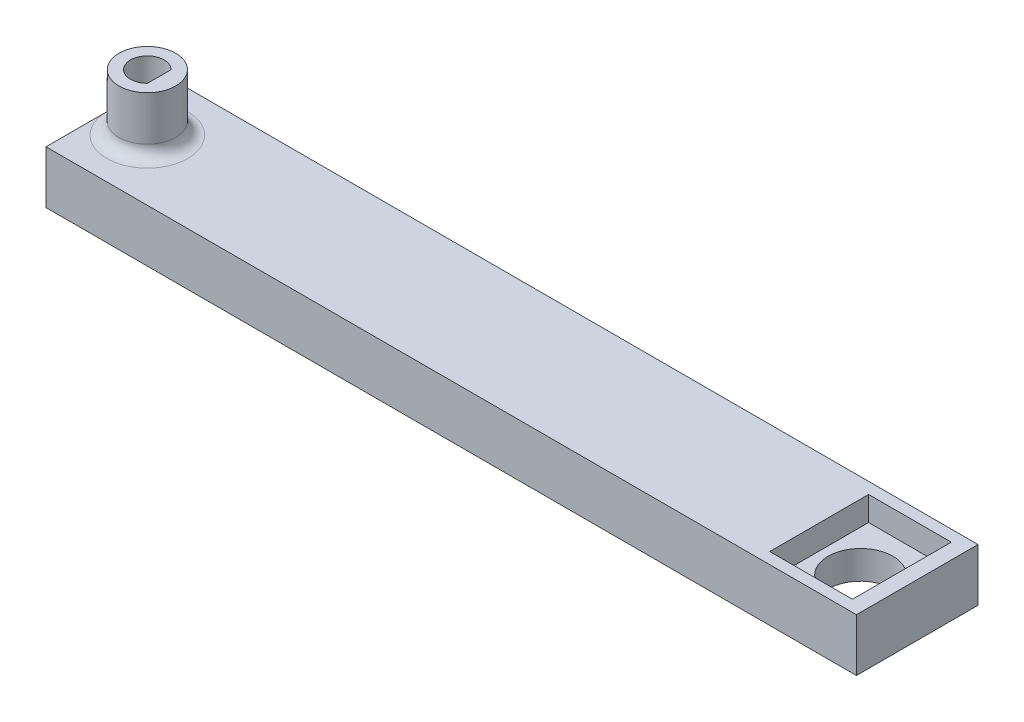
ISO-10303-21;
HEADER;
FILE_DESCRIPTION(('STEP AP214'),'2;1');
FILE_NAME('part.step','',(''),(''),'','','');
FILE_SCHEMA(('AUTOMOTIVE_DESIGN { 1 0 10303 214 1 1 1 1 }'));
ENDSEC;
DATA;
#1=APPLICATION_CONTEXT('core data for automotive mechanical design processes');
#2=APPLICATION_PROTOCOL_DEFINITION('international standard','automotive_design',2000,#1);
#3=PRODUCT_CONTEXT('',#1,'mechanical');
#4=PRODUCT('Part','Part','',(#3));
#5=PRODUCT_RELATED_PRODUCT_CATEGORY('part','',(#4));
#6=PRODUCT_DEFINITION_FORMATION('','',#4);
#7=PRODUCT_DEFINITION_CONTEXT('part definition',#1,'design');
#8=PRODUCT_DEFINITION('design','',#6,#7);
#9=PRODUCT_DEFINITION_SHAPE('','',#8);
#10=(LENGTH_UNIT() NAMED_UNIT(*) SI_UNIT(.MILLI.,.METRE.));
#11=(NAMED_UNIT(*) PLANE_ANGLE_UNIT() SI_UNIT($,.RADIAN.));
#12=(NAMED_UNIT(*) SI_UNIT($,.STERADIAN.) SOLID_ANGLE_UNIT());
#13=UNCERTAINTY_MEASURE_WITH_UNIT(LENGTH_MEASURE(1.E-05),#10,'distance_accuracy_value','');
#14=(GEOMETRIC_REPRESENTATION_CONTEXT(3) GLOBAL_UNCERTAINTY_ASSIGNED_CONTEXT((#13)) GLOBAL_UNIT_ASSIGNED_CONTEXT((#10,
#11,#12)) REPRESENTATION_CONTEXT('',''));
#15=CARTESIAN_POINT('',(0.,0.,0.));
#16=DIRECTION('',(0.,0.,1.));
#17=DIRECTION('',(1.,0.,0.));
#18=AXIS2_PLACEMENT_3D('',#15,#16,#17);
#19=CARTESIAN_POINT('',(-45.,10.25,0.));
#20=DIRECTION('',(0.,1.,0.));
#21=DIRECTION('',(0.,0.,1.));
#22=AXIS2_PLACEMENT_3D('',#19,#20,#21);
#23=PLANE('',#22);
#24=CARTESIAN_POINT('',(-45.,10.25,0.));
#25=DIRECTION('',(0.,1.,0.));
#26=DIRECTION('',(0.,0.,1.));
#27=AXIS2_PLACEMENT_3D('',#24,#25,#26);
#28=CIRCLE('',#27,3.5);
#29=CARTESIAN_POINT('',(-45.,10.25,3.5));
#30=VERTEX_POINT('',#29);
#31=EDGE_CURVE('E175',#30,#30,#28,.T.);
#32=ORIENTED_EDGE('',*,*,#31,.T.);
#33=EDGE_LOOP('',(#32));
#34=FACE_BOUND('',#33,.T.);
#35=CARTESIAN_POINT('',(-45.,10.25,0.));
#36=DIRECTION('',(0.,1.,0.));
#37=DIRECTION('',(0.,0.,1.));
#38=AXIS2_PLACEMENT_3D('',#35,#36,#37);
#39=CIRCLE('',#38,2.075);
#40=CARTESIAN_POINT('',(-43.525,10.25,-1.45945195193264));
#41=VERTEX_POINT('',#40);
#42=CARTESIAN_POINT('',(-43.525,10.25,1.45945195193264));
#43=VERTEX_POINT('',#42);
#44=EDGE_CURVE('E168',#41,#43,#39,.T.);
#45=ORIENTED_EDGE('',*,*,#44,.F.);
#46=DIRECTION('',(0.,0.,1.));
#47=VECTOR('',#46,1.);
#48=CARTESIAN_POINT('',(-43.525,10.25,0.));
#49=LINE('',#48,#47);
#50=EDGE_CURVE('E61',#41,#43,#49,.T.);
#51=ORIENTED_EDGE('',*,*,#50,.T.);
#52=EDGE_LOOP('',(#45,#51));
#53=FACE_BOUND('',#52,.T.);
#54=ADVANCED_FACE('F43',(#34,#53),#23,.T.);
#55=CARTESIAN_POINT('',(0.,-3.25,0.));
#56=DIRECTION('',(0.,-1.,0.));
#57=DIRECTION('',(0.,0.,-1.));
#58=AXIS2_PLACEMENT_3D('',#55,#56,#57);
#59=PLANE('',#58);
#60=CARTESIAN_POINT('',(43.,-3.25,0.));
#61=DIRECTION('',(0.,-1.,0.));
#62=DIRECTION('',(0.,0.,-1.));
#63=AXIS2_PLACEMENT_3D('',#60,#61,#62);
#64=CIRCLE('',#63,4.00000000000001);
#65=CARTESIAN_POINT('',(43.,-3.25,-4.00000000000001));
#66=VERTEX_POINT('',#65);
#67=EDGE_CURVE('E180',#66,#66,#64,.T.);
#68=ORIENTED_EDGE('',*,*,#67,.F.);
#69=EDGE_LOOP('',(#68));
#70=FACE_BOUND('',#69,.T.);
#71=DIRECTION('',(0.,0.,-1.));
#72=VECTOR('',#71,1.);
#73=CARTESIAN_POINT('',(50.,-3.25,7.5));
#74=LINE('',#73,#72);
#75=CARTESIAN_POINT('',(50.,-3.25,7.5));
#76=VERTEX_POINT('',#75);
#77=CARTESIAN_POINT('',(50.,-3.25,-7.5));
#78=VERTEX_POINT('',#77);
#79=EDGE_CURVE('E253',#76,#78,#74,.T.);
#80=ORIENTED_EDGE('',*,*,#79,.F.);
#81=DIRECTION('',(1.,0.,0.));
#82=VECTOR('',#81,1.);
#83=CARTESIAN_POINT('',(-50.,-3.25,7.5));
#84=LINE('',#83,#82);
#85=CARTESIAN_POINT('',(-50.,-3.25,7.5));
#86=VERTEX_POINT('',#85);
#87=EDGE_CURVE('E269',#86,#76,#84,.T.);
#88=ORIENTED_EDGE('',*,*,#87,.F.);
#89=DIRECTION('',(0.,0.,1.));
#90=VECTOR('',#89,1.);
#91=CARTESIAN_POINT('',(-50.,-3.25,7.5));
#92=LINE('',#91,#90);
#93=CARTESIAN_POINT('',(-50.,-3.25,-7.5));
#94=VERTEX_POINT('',#93);
#95=EDGE_CURVE('E282',#94,#86,#92,.T.);
#96=ORIENTED_EDGE('',*,*,#95,.F.);
#97=DIRECTION('',(-1.,0.,0.));
#98=VECTOR('',#97,1.);
#99=CARTESIAN_POINT('',(-50.,-3.25,-7.5));
#100=LINE('',#99,#98);
#101=EDGE_CURVE('E280',#78,#94,#100,.T.);
#102=ORIENTED_EDGE('',*,*,#101,.F.);
#103=EDGE_LOOP('',(#80,#88,#96,#102));
#104=FACE_BOUND('',#103,.T.);
#105=DIRECTION('',(0.,0.,1.));
#106=VECTOR('',#105,1.);
#107=CARTESIAN_POINT('',(23.5,-3.25,-1.125));
#108=LINE('',#107,#106);
#109=CARTESIAN_POINT('',(23.5,-3.25,-1.125));
#110=VERTEX_POINT('',#109);
#111=CARTESIAN_POINT('',(23.5,-3.25,1.125));
#112=VERTEX_POINT('',#111);
#113=EDGE_CURVE('E260',#110,#112,#108,.T.);
#114=ORIENTED_EDGE('',*,*,#113,.F.);
#115=DIRECTION('',(-1.,0.,0.));
#116=VECTOR('',#115,1.);
#117=CARTESIAN_POINT('',(0.,-3.25,-1.125));
#118=LINE('',#117,#116);
#119=CARTESIAN_POINT('',(15.,-3.25,-1.125));
#120=VERTEX_POINT('',#119);
#121=EDGE_CURVE('E219',#110,#120,#118,.T.);
#122=ORIENTED_EDGE('',*,*,#121,.T.);
#123=DIRECTION('',(0.,0.,1.));
#124=VECTOR('',#123,1.);
#125=CARTESIAN_POINT('',(15.,-3.25,-1.125));
#126=LINE('',#125,#124);
#127=CARTESIAN_POINT('',(15.,-3.25,1.125));
#128=VERTEX_POINT('',#127);
#129=EDGE_CURVE('E234',#120,#128,#126,.T.);
#130=ORIENTED_EDGE('',*,*,#129,.T.);
#131=DIRECTION('',(-1.,0.,0.));
#132=VECTOR('',#131,1.);
#133=CARTESIAN_POINT('',(0.,-3.25,1.125));
#134=LINE('',#133,#132);
#135=EDGE_CURVE('E237',#112,#128,#134,.T.);
#136=ORIENTED_EDGE('',*,*,#135,.F.);
#137=EDGE_LOOP('',(#114,#122,#130,#136));
#138=FACE_BOUND('',#137,.T.);
#139=ADVANCED_FACE('F309',(#70,#104,#138),#59,.T.);
#140=CARTESIAN_POINT('',(50.,3.25,7.5));
#141=DIRECTION('',(-1.,0.,0.));
#142=DIRECTION('',(0.,0.,1.));
#143=AXIS2_PLACEMENT_3D('',#140,#141,#142);
#144=PLANE('',#143);
#145=ORIENTED_EDGE('',*,*,#79,.T.);
#146=DIRECTION('',(0.,-1.,0.));
#147=VECTOR('',#146,1.);
#148=CARTESIAN_POINT('',(50.,3.25,-7.5));
#149=LINE('',#148,#147);
#150=CARTESIAN_POINT('',(50.,3.25,-7.5));
#151=VERTEX_POINT('',#150);
#152=EDGE_CURVE('E293',#151,#78,#149,.T.);
#153=ORIENTED_EDGE('',*,*,#152,.F.);
#154=DIRECTION('',(0.,0.,-1.));
#155=VECTOR('',#154,1.);
#156=CARTESIAN_POINT('',(50.,3.25,7.5));
#157=LINE('',#156,#155);
#158=CARTESIAN_POINT('',(50.,3.25,7.5));
#159=VERTEX_POINT('',#158);
#160=EDGE_CURVE('E265',#159,#151,#157,.T.);
#161=ORIENTED_EDGE('',*,*,#160,.F.);
#162=DIRECTION('',(0.,-1.,0.));
#163=VECTOR('',#162,1.);
#164=CARTESIAN_POINT('',(50.,3.25,7.5));
#165=LINE('',#164,#163);
#166=EDGE_CURVE('E277',#159,#76,#165,.T.);
#167=ORIENTED_EDGE('',*,*,#166,.T.);
#168=EDGE_LOOP('',(#145,#153,#161,#167));
#169=FACE_BOUND('',#168,.T.);
#170=ADVANCED_FACE('F315',(#169),#144,.F.);
#171=CARTESIAN_POINT('',(-50.,3.25,-7.5));
#172=DIRECTION('',(0.,0.,1.));
#173=DIRECTION('',(1.,0.,0.));
#174=AXIS2_PLACEMENT_3D('',#171,#172,#173);
#175=PLANE('',#174);
#176=ORIENTED_EDGE('',*,*,#101,.T.);
#177=DIRECTION('',(0.,-1.,0.));
#178=VECTOR('',#177,1.);
#179=CARTESIAN_POINT('',(-50.,3.25,-7.5));
#180=LINE('',#179,#178);
#181=CARTESIAN_POINT('',(-50.,3.25,-7.5));
#182=VERTEX_POINT('',#181);
#183=EDGE_CURVE('E290',#182,#94,#180,.T.);
#184=ORIENTED_EDGE('',*,*,#183,.F.);
#185=DIRECTION('',(-1.,0.,0.));
#186=VECTOR('',#185,1.);
#187=CARTESIAN_POINT('',(-50.,3.25,-7.5));
#188=LINE('',#187,#186);
#189=EDGE_CURVE('E268',#151,#182,#188,.T.);
#190=ORIENTED_EDGE('',*,*,#189,.F.);
#191=ORIENTED_EDGE('',*,*,#152,.T.);
#192=EDGE_LOOP('',(#176,#184,#190,#191));
#193=FACE_BOUND('',#192,.T.);
#194=ADVANCED_FACE('F387',(#193),#175,.F.);
#195=CARTESIAN_POINT('',(-50.,3.25,7.5));
#196=DIRECTION('',(1.,0.,0.));
#197=DIRECTION('',(0.,0.,-1.));
#198=AXIS2_PLACEMENT_3D('',#195,#196,#197);
#199=PLANE('',#198);
#200=ORIENTED_EDGE('',*,*,#95,.T.);
#201=DIRECTION('',(0.,-1.,0.));
#202=VECTOR('',#201,1.);
#203=CARTESIAN_POINT('',(-50.,3.25,7.5));
#204=LINE('',#203,#202);
#205=CARTESIAN_POINT('',(-50.,3.25,7.5));
#206=VERTEX_POINT('',#205);
#207=EDGE_CURVE('E287',#206,#86,#204,.T.);
#208=ORIENTED_EDGE('',*,*,#207,.F.);
#209=DIRECTION('',(0.,0.,1.));
#210=VECTOR('',#209,1.);
#211=CARTESIAN_POINT('',(-50.,3.25,7.5));
#212=LINE('',#211,#210);
#213=CARTESIAN_POINT('',(-50.,3.25,0.));
#214=VERTEX_POINT('',#213);
#215=EDGE_CURVE('E271',#214,#206,#212,.T.);
#216=ORIENTED_EDGE('',*,*,#215,.F.);
#217=EDGE_CURVE('E272',#182,#214,#212,.T.);
#218=ORIENTED_EDGE('',*,*,#217,.F.);
#219=ORIENTED_EDGE('',*,*,#183,.T.);
#220=EDGE_LOOP('',(#200,#208,#216,#218,#219));
#221=FACE_BOUND('',#220,.T.);
#222=ADVANCED_FACE('F383',(#221),#199,.F.);
#223=CARTESIAN_POINT('',(-50.,3.25,7.5));
#224=DIRECTION('',(0.,0.,-1.));
#225=DIRECTION('',(-1.,0.,0.));
#226=AXIS2_PLACEMENT_3D('',#223,#224,#225);
#227=PLANE('',#226);
#228=ORIENTED_EDGE('',*,*,#87,.T.);
#229=ORIENTED_EDGE('',*,*,#166,.F.);
#230=DIRECTION('',(1.,0.,0.));
#231=VECTOR('',#230,1.);
#232=CARTESIAN_POINT('',(-50.,3.25,7.5));
#233=LINE('',#232,#231);
#234=EDGE_CURVE('E275',#206,#159,#233,.T.);
#235=ORIENTED_EDGE('',*,*,#234,.F.);
#236=ORIENTED_EDGE('',*,*,#207,.T.);
#237=EDGE_LOOP('',(#228,#229,#235,#236));
#238=FACE_BOUND('',#237,.T.);
#239=ADVANCED_FACE('F378',(#238),#227,.F.);
#240=CARTESIAN_POINT('',(0.,3.25,0.));
#241=DIRECTION('',(0.,-1.,0.));
#242=DIRECTION('',(0.,0.,-1.));
#243=AXIS2_PLACEMENT_3D('',#240,#241,#242);
#244=PLANE('',#243);
#245=DIRECTION('',(-1.,0.,0.));
#246=VECTOR('',#245,1.);
#247=CARTESIAN_POINT('',(37.9,3.25,-6.1));
#248=LINE('',#247,#246);
#249=CARTESIAN_POINT('',(48.1,3.25,-6.1));
#250=VERTEX_POINT('',#249);
#251=CARTESIAN_POINT('',(37.9,3.25,-6.1));
#252=VERTEX_POINT('',#251);
#253=EDGE_CURVE('E199',#250,#252,#248,.T.);
#254=ORIENTED_EDGE('',*,*,#253,.F.);
#255=DIRECTION('',(0.,0.,-1.));
#256=VECTOR('',#255,1.);
#257=CARTESIAN_POINT('',(48.1,3.25,6.1));
#258=LINE('',#257,#256);
#259=CARTESIAN_POINT('',(48.1,3.25,6.1));
#260=VERTEX_POINT('',#259);
#261=EDGE_CURVE('E183',#260,#250,#258,.T.);
#262=ORIENTED_EDGE('',*,*,#261,.F.);
#263=DIRECTION('',(1.,0.,0.));
#264=VECTOR('',#263,1.);
#265=CARTESIAN_POINT('',(37.9,3.25,6.1));
#266=LINE('',#265,#264);
#267=CARTESIAN_POINT('',(37.9,3.25,6.1));
#268=VERTEX_POINT('',#267);
#269=EDGE_CURVE('E188',#268,#260,#266,.T.);
#270=ORIENTED_EDGE('',*,*,#269,.F.);
#271=DIRECTION('',(0.,0.,1.));
#272=VECTOR('',#271,1.);
#273=CARTESIAN_POINT('',(37.9,3.25,6.1));
#274=LINE('',#273,#272);
#275=EDGE_CURVE('E202',#252,#268,#274,.T.);
#276=ORIENTED_EDGE('',*,*,#275,.F.);
#277=EDGE_LOOP('',(#254,#262,#270,#276));
#278=FACE_BOUND('',#277,.T.);
#279=ORIENTED_EDGE('',*,*,#217,.T.);
#280=CARTESIAN_POINT('',(-45.,3.25,0.));
#281=DIRECTION('',(0.,-1.,0.));
#282=DIRECTION('',(0.,0.,-1.));
#283=AXIS2_PLACEMENT_3D('',#280,#281,#282);
#284=CIRCLE('',#283,5.);
#285=EDGE_CURVE('E11',#214,#214,#284,.T.);
#286=ORIENTED_EDGE('',*,*,#285,.T.);
#287=ORIENTED_EDGE('',*,*,#215,.T.);
#288=ORIENTED_EDGE('',*,*,#234,.T.);
#289=ORIENTED_EDGE('',*,*,#160,.T.);
#290=ORIENTED_EDGE('',*,*,#189,.T.);
#291=EDGE_LOOP('',(#279,#286,#287,#288,#289,#290));
#292=FACE_BOUND('',#291,.T.);
#293=ADVANCED_FACE('F375',(#278,#292),#244,.F.);
#294=CARTESIAN_POINT('',(15.,0.,-1.125));
#295=DIRECTION('',(1.,0.,0.));
#296=DIRECTION('',(0.,0.,-1.));
#297=AXIS2_PLACEMENT_3D('',#294,#295,#296);
#298=PLANE('',#297);
#299=DIRECTION('',(0.,1.,0.));
#300=VECTOR('',#299,1.);
#301=CARTESIAN_POINT('',(15.,0.,1.125));
#302=LINE('',#301,#300);
#303=CARTESIAN_POINT('',(15.,-2.25,1.125));
#304=VERTEX_POINT('',#303);
#305=EDGE_CURVE('E209',#128,#304,#302,.T.);
#306=ORIENTED_EDGE('',*,*,#305,.F.);
#307=ORIENTED_EDGE('',*,*,#129,.F.);
#308=DIRECTION('',(0.,1.,0.));
#309=VECTOR('',#308,1.);
#310=CARTESIAN_POINT('',(15.,0.,-1.125));
#311=LINE('',#310,#309);
#312=CARTESIAN_POINT('',(15.,-2.25,-1.125));
#313=VERTEX_POINT('',#312);
#314=EDGE_CURVE('E216',#120,#313,#311,.T.);
#315=ORIENTED_EDGE('',*,*,#314,.T.);
#316=DIRECTION('',(0.,0.,1.));
#317=VECTOR('',#316,1.);
#318=CARTESIAN_POINT('',(15.,-2.25,-1.125));
#319=LINE('',#318,#317);
#320=EDGE_CURVE('E250',#313,#304,#319,.T.);
#321=ORIENTED_EDGE('',*,*,#320,.T.);
#322=EDGE_LOOP('',(#306,#307,#315,#321));
#323=FACE_BOUND('',#322,.T.);
#324=ADVANCED_FACE('F361',(#323),#298,.T.);
#325=CARTESIAN_POINT('',(0.,-2.25,-1.125));
#326=DIRECTION('',(0.,1.,0.));
#327=DIRECTION('',(-1.,0.,0.));
#328=AXIS2_PLACEMENT_3D('',#325,#326,#327);
#329=PLANE('',#328);
#330=DIRECTION('',(-1.,0.,0.));
#331=VECTOR('',#330,1.);
#332=CARTESIAN_POINT('',(0.,-2.25,1.125));
#333=LINE('',#332,#331);
#334=CARTESIAN_POINT('',(9.99999999999999,-2.25,1.125));
#335=VERTEX_POINT('',#334);
#336=EDGE_CURVE('E220',#304,#335,#333,.T.);
#337=ORIENTED_EDGE('',*,*,#336,.F.);
#338=ORIENTED_EDGE('',*,*,#320,.F.);
#339=DIRECTION('',(-1.,0.,0.));
#340=VECTOR('',#339,1.);
#341=CARTESIAN_POINT('',(0.,-2.25,-1.125));
#342=LINE('',#341,#340);
#343=CARTESIAN_POINT('',(9.99999999999999,-2.25,-1.125));
#344=VERTEX_POINT('',#343);
#345=EDGE_CURVE('E232',#313,#344,#342,.T.);
#346=ORIENTED_EDGE('',*,*,#345,.T.);
#347=DIRECTION('',(0.,0.,1.));
#348=VECTOR('',#347,1.);
#349=CARTESIAN_POINT('',(9.99999999999999,-2.25,-1.125));
#350=LINE('',#349,#348);
#351=EDGE_CURVE('E254',#344,#335,#350,.T.);
#352=ORIENTED_EDGE('',*,*,#351,.T.);
#353=EDGE_LOOP('',(#337,#338,#346,#352));
#354=FACE_BOUND('',#353,.T.);
#355=ADVANCED_FACE('F357',(#354),#329,.T.);
#356=CARTESIAN_POINT('',(9.99999999999999,0.,-1.125));
#357=DIRECTION('',(-1.,0.,0.));
#358=DIRECTION('',(0.,0.,1.));
#359=AXIS2_PLACEMENT_3D('',#356,#357,#358);
#360=PLANE('',#359);
#361=DIRECTION('',(0.,-1.,0.));
#362=VECTOR('',#361,1.);
#363=CARTESIAN_POINT('',(9.99999999999999,0.,1.125));
#364=LINE('',#363,#362);
#365=CARTESIAN_POINT('',(9.99999999999999,1.,1.125));
#366=VERTEX_POINT('',#365);
#367=EDGE_CURVE('E245',#366,#335,#364,.T.);
#368=ORIENTED_EDGE('',*,*,#367,.T.);
#369=ORIENTED_EDGE('',*,*,#351,.F.);
#370=DIRECTION('',(0.,-1.,0.));
#371=VECTOR('',#370,1.);
#372=CARTESIAN_POINT('',(9.99999999999999,0.,-1.125));
#373=LINE('',#372,#371);
#374=CARTESIAN_POINT('',(9.99999999999999,1.,-1.125));
#375=VERTEX_POINT('',#374);
#376=EDGE_CURVE('E229',#375,#344,#373,.T.);
#377=ORIENTED_EDGE('',*,*,#376,.F.);
#378=DIRECTION('',(0.,0.,1.));
#379=VECTOR('',#378,1.);
#380=CARTESIAN_POINT('',(9.99999999999999,1.,-1.125));
#381=LINE('',#380,#379);
#382=EDGE_CURVE('E256',#375,#366,#381,.T.);
#383=ORIENTED_EDGE('',*,*,#382,.T.);
#384=EDGE_LOOP('',(#368,#369,#377,#383));
#385=FACE_BOUND('',#384,.T.);
#386=ADVANCED_FACE('F360',(#385),#360,.F.);
#387=CARTESIAN_POINT('',(0.,0.999999999999999,-1.125));
#388=DIRECTION('',(0.,1.,0.));
#389=DIRECTION('',(-1.,0.,0.));
#390=AXIS2_PLACEMENT_3D('',#387,#388,#389);
#391=PLANE('',#390);
#392=DIRECTION('',(-1.,0.,0.));
#393=VECTOR('',#392,1.);
#394=CARTESIAN_POINT('',(0.,0.999999999999999,1.125));
#395=LINE('',#394,#393);
#396=CARTESIAN_POINT('',(23.5,1.,1.125));
#397=VERTEX_POINT('',#396);
#398=EDGE_CURVE('E242',#397,#366,#395,.T.);
#399=ORIENTED_EDGE('',*,*,#398,.T.);
#400=ORIENTED_EDGE('',*,*,#382,.F.);
#401=DIRECTION('',(-1.,0.,0.));
#402=VECTOR('',#401,1.);
#403=CARTESIAN_POINT('',(0.,0.999999999999999,-1.125));
#404=LINE('',#403,#402);
#405=CARTESIAN_POINT('',(23.5,1.,-1.125));
#406=VERTEX_POINT('',#405);
#407=EDGE_CURVE('E226',#406,#375,#404,.T.);
#408=ORIENTED_EDGE('',*,*,#407,.F.);
#409=DIRECTION('',(0.,0.,1.));
#410=VECTOR('',#409,1.);
#411=CARTESIAN_POINT('',(23.5,1.,-1.125));
#412=LINE('',#411,#410);
#413=EDGE_CURVE('E258',#406,#397,#412,.T.);
#414=ORIENTED_EDGE('',*,*,#413,.T.);
#415=EDGE_LOOP('',(#399,#400,#408,#414));
#416=FACE_BOUND('',#415,.T.);
#417=ADVANCED_FACE('F365',(#416),#391,.F.);
#418=CARTESIAN_POINT('',(23.5,0.,-1.125));
#419=DIRECTION('',(1.,0.,0.));
#420=DIRECTION('',(0.,0.,-1.));
#421=AXIS2_PLACEMENT_3D('',#418,#419,#420);
#422=PLANE('',#421);
#423=DIRECTION('',(0.,1.,0.));
#424=VECTOR('',#423,1.);
#425=CARTESIAN_POINT('',(23.5,0.,1.125));
#426=LINE('',#425,#424);
#427=EDGE_CURVE('E239',#112,#397,#426,.T.);
#428=ORIENTED_EDGE('',*,*,#427,.T.);
#429=ORIENTED_EDGE('',*,*,#413,.F.);
#430=DIRECTION('',(0.,1.,0.));
#431=VECTOR('',#430,1.);
#432=CARTESIAN_POINT('',(23.5,0.,-1.125));
#433=LINE('',#432,#431);
#434=EDGE_CURVE('E223',#110,#406,#433,.T.);
#435=ORIENTED_EDGE('',*,*,#434,.F.);
#436=ORIENTED_EDGE('',*,*,#113,.T.);
#437=EDGE_LOOP('',(#428,#429,#435,#436));
#438=FACE_BOUND('',#437,.T.);
#439=ADVANCED_FACE('F352',(#438),#422,.F.);
#440=CARTESIAN_POINT('',(0.,0.,-1.125));
#441=DIRECTION('',(0.,0.,1.));
#442=DIRECTION('',(1.,0.,0.));
#443=AXIS2_PLACEMENT_3D('',#440,#441,#442);
#444=PLANE('',#443);
#445=ORIENTED_EDGE('',*,*,#314,.F.);
#446=ORIENTED_EDGE('',*,*,#121,.F.);
#447=ORIENTED_EDGE('',*,*,#434,.T.);
#448=ORIENTED_EDGE('',*,*,#407,.T.);
#449=ORIENTED_EDGE('',*,*,#376,.T.);
#450=ORIENTED_EDGE('',*,*,#345,.F.);
#451=EDGE_LOOP('',(#445,#446,#447,#448,#449,#450));
#452=FACE_BOUND('',#451,.T.);
#453=ADVANCED_FACE('F349',(#452),#444,.T.);
#454=CARTESIAN_POINT('',(0.,0.,1.125));
#455=DIRECTION('',(0.,0.,1.));
#456=DIRECTION('',(1.,0.,0.));
#457=AXIS2_PLACEMENT_3D('',#454,#455,#456);
#458=PLANE('',#457);
#459=ORIENTED_EDGE('',*,*,#305,.T.);
#460=ORIENTED_EDGE('',*,*,#336,.T.);
#461=ORIENTED_EDGE('',*,*,#367,.F.);
#462=ORIENTED_EDGE('',*,*,#398,.F.);
#463=ORIENTED_EDGE('',*,*,#427,.F.);
#464=ORIENTED_EDGE('',*,*,#135,.T.);
#465=EDGE_LOOP('',(#459,#460,#461,#462,#463,#464));
#466=FACE_BOUND('',#465,.T.);
#467=ADVANCED_FACE('F347',(#466),#458,.F.);
#468=CARTESIAN_POINT('',(48.1,0.25,6.1));
#469=DIRECTION('',(1.,0.,0.));
#470=DIRECTION('',(0.,0.,-1.));
#471=AXIS2_PLACEMENT_3D('',#468,#469,#470);
#472=PLANE('',#471);
#473=ORIENTED_EDGE('',*,*,#261,.T.);
#474=DIRECTION('',(0.,1.,0.));
#475=VECTOR('',#474,1.);
#476=CARTESIAN_POINT('',(48.1,0.25,-6.1));
#477=LINE('',#476,#475);
#478=CARTESIAN_POINT('',(48.1,0.25,-6.1));
#479=VERTEX_POINT('',#478);
#480=EDGE_CURVE('E197',#479,#250,#477,.T.);
#481=ORIENTED_EDGE('',*,*,#480,.F.);
#482=DIRECTION('',(0.,0.,-1.));
#483=VECTOR('',#482,1.);
#484=CARTESIAN_POINT('',(48.1,0.25,6.1));
#485=LINE('',#484,#483);
#486=CARTESIAN_POINT('',(48.1,0.25,6.1));
#487=VERTEX_POINT('',#486);
#488=EDGE_CURVE('E184',#487,#479,#485,.T.);
#489=ORIENTED_EDGE('',*,*,#488,.F.);
#490=DIRECTION('',(0.,1.,0.));
#491=VECTOR('',#490,1.);
#492=CARTESIAN_POINT('',(48.1,0.25,6.1));
#493=LINE('',#492,#491);
#494=EDGE_CURVE('E207',#487,#260,#493,.T.);
#495=ORIENTED_EDGE('',*,*,#494,.T.);
#496=EDGE_LOOP('',(#473,#481,#489,#495));
#497=FACE_BOUND('',#496,.T.);
#498=ADVANCED_FACE('F337',(#497),#472,.F.);
#499=CARTESIAN_POINT('',(37.9,0.25,6.1));
#500=DIRECTION('',(0.,0.,1.));
#501=DIRECTION('',(1.,0.,0.));
#502=AXIS2_PLACEMENT_3D('',#499,#500,#501);
#503=PLANE('',#502);
#504=ORIENTED_EDGE('',*,*,#269,.T.);
#505=ORIENTED_EDGE('',*,*,#494,.F.);
#506=DIRECTION('',(1.,0.,0.));
#507=VECTOR('',#506,1.);
#508=CARTESIAN_POINT('',(37.9,0.25,6.1));
#509=LINE('',#508,#507);
#510=CARTESIAN_POINT('',(37.9,0.25,6.1));
#511=VERTEX_POINT('',#510);
#512=EDGE_CURVE('E194',#511,#487,#509,.T.);
#513=ORIENTED_EDGE('',*,*,#512,.F.);
#514=DIRECTION('',(0.,1.,0.));
#515=VECTOR('',#514,1.);
#516=CARTESIAN_POINT('',(37.9,0.25,6.1));
#517=LINE('',#516,#515);
#518=EDGE_CURVE('E210',#511,#268,#517,.T.);
#519=ORIENTED_EDGE('',*,*,#518,.T.);
#520=EDGE_LOOP('',(#504,#505,#513,#519));
#521=FACE_BOUND('',#520,.T.);
#522=ADVANCED_FACE('F333',(#521),#503,.F.);
#523=CARTESIAN_POINT('',(37.9,0.25,6.1));
#524=DIRECTION('',(-1.,0.,0.));
#525=DIRECTION('',(0.,0.,1.));
#526=AXIS2_PLACEMENT_3D('',#523,#524,#525);
#527=PLANE('',#526);
#528=ORIENTED_EDGE('',*,*,#275,.T.);
#529=ORIENTED_EDGE('',*,*,#518,.F.);
#530=DIRECTION('',(0.,0.,1.));
#531=VECTOR('',#530,1.);
#532=CARTESIAN_POINT('',(37.9,0.25,6.1));
#533=LINE('',#532,#531);
#534=CARTESIAN_POINT('',(37.9,0.25,-6.1));
#535=VERTEX_POINT('',#534);
#536=EDGE_CURVE('E191',#535,#511,#533,.T.);
#537=ORIENTED_EDGE('',*,*,#536,.F.);
#538=DIRECTION('',(0.,1.,0.));
#539=VECTOR('',#538,1.);
#540=CARTESIAN_POINT('',(37.9,0.25,-6.1));
#541=LINE('',#540,#539);
#542=EDGE_CURVE('E212',#535,#252,#541,.T.);
#543=ORIENTED_EDGE('',*,*,#542,.T.);
#544=EDGE_LOOP('',(#528,#529,#537,#543));
#545=FACE_BOUND('',#544,.T.);
#546=ADVANCED_FACE('F336',(#545),#527,.F.);
#547=CARTESIAN_POINT('',(37.9,0.25,-6.1));
#548=DIRECTION('',(0.,0.,-1.));
#549=DIRECTION('',(-1.,0.,0.));
#550=AXIS2_PLACEMENT_3D('',#547,#548,#549);
#551=PLANE('',#550);
#552=ORIENTED_EDGE('',*,*,#253,.T.);
#553=ORIENTED_EDGE('',*,*,#542,.F.);
#554=DIRECTION('',(-1.,0.,0.));
#555=VECTOR('',#554,1.);
#556=CARTESIAN_POINT('',(37.9,0.25,-6.1));
#557=LINE('',#556,#555);
#558=EDGE_CURVE('E187',#479,#535,#557,.T.);
#559=ORIENTED_EDGE('',*,*,#558,.F.);
#560=ORIENTED_EDGE('',*,*,#480,.T.);
#561=EDGE_LOOP('',(#552,#553,#559,#560));
#562=FACE_BOUND('',#561,.T.);
#563=ADVANCED_FACE('F331',(#562),#551,.F.);
#564=CARTESIAN_POINT('',(0.,0.25,0.));
#565=DIRECTION('',(0.,-1.,0.));
#566=DIRECTION('',(0.,0.,-1.));
#567=AXIS2_PLACEMENT_3D('',#564,#565,#566);
#568=PLANE('',#567);
#569=CARTESIAN_POINT('',(43.,0.25,0.));
#570=DIRECTION('',(0.,-1.,0.));
#571=DIRECTION('',(0.,0.,-1.));
#572=AXIS2_PLACEMENT_3D('',#569,#570,#571);
#573=CIRCLE('',#572,4.00000000000001);
#574=CARTESIAN_POINT('',(43.,0.25,-4.00000000000001));
#575=VERTEX_POINT('',#574);
#576=EDGE_CURVE('E179',#575,#575,#573,.T.);
#577=ORIENTED_EDGE('',*,*,#576,.T.);
#578=EDGE_LOOP('',(#577));
#579=FACE_BOUND('',#578,.T.);
#580=ORIENTED_EDGE('',*,*,#488,.T.);
#581=ORIENTED_EDGE('',*,*,#558,.T.);
#582=ORIENTED_EDGE('',*,*,#536,.T.);
#583=ORIENTED_EDGE('',*,*,#512,.T.);
#584=EDGE_LOOP('',(#580,#581,#582,#583));
#585=FACE_BOUND('',#584,.T.);
#586=ADVANCED_FACE('F327',(#579,#585),#568,.F.);
#587=CARTESIAN_POINT('',(43.,3.25,0.));
#588=DIRECTION('',(0.,-1.,0.));
#589=DIRECTION('',(0.,0.,-1.));
#590=AXIS2_PLACEMENT_3D('',#587,#588,#589);
#591=CYLINDRICAL_SURFACE('',#590,4.00000000000001);
#592=CARTESIAN_POINT('',(43.,-3.25,-4.00000000000001));
#593=CARTESIAN_POINT('',(43.,-3.21354166666667,-4.00000000000001));
#594=CARTESIAN_POINT('',(43.,-3.17708333333333,-4.00000000000001));
#595=CARTESIAN_POINT('',(43.,-3.10416666666667,-4.00000000000001));
#596=CARTESIAN_POINT('',(43.,-3.06770833333333,-4.00000000000001));
#597=CARTESIAN_POINT('',(43.,-2.99479166666667,-4.00000000000001));
#598=CARTESIAN_POINT('',(43.,-2.95833333333333,-4.00000000000001));
#599=CARTESIAN_POINT('',(43.,-2.88541666666667,-4.00000000000001));
#600=CARTESIAN_POINT('',(43.,-2.84895833333333,-4.00000000000001));
#601=CARTESIAN_POINT('',(43.,-2.77604166666667,-4.00000000000001));
#602=CARTESIAN_POINT('',(43.,-2.73958333333333,-4.00000000000001));
#603=CARTESIAN_POINT('',(43.,-2.66666666666667,-4.00000000000001));
#604=CARTESIAN_POINT('',(43.,-2.63020833333333,-4.00000000000001));
#605=CARTESIAN_POINT('',(43.,-2.55729166666667,-4.00000000000001));
#606=CARTESIAN_POINT('',(43.,-2.52083333333333,-4.00000000000001));
#607=CARTESIAN_POINT('',(43.,-2.44791666666667,-4.00000000000001));
#608=CARTESIAN_POINT('',(43.,-2.41145833333333,-4.00000000000001));
#609=CARTESIAN_POINT('',(43.,-2.33854166666667,-4.00000000000001));
#610=CARTESIAN_POINT('',(43.,-2.30208333333333,-4.00000000000001));
#611=CARTESIAN_POINT('',(43.,-2.22916666666667,-4.00000000000001));
#612=CARTESIAN_POINT('',(43.,-2.19270833333333,-4.00000000000001));
#613=CARTESIAN_POINT('',(43.,-2.11979166666667,-4.00000000000001));
#614=CARTESIAN_POINT('',(43.,-2.08333333333333,-4.00000000000001));
#615=CARTESIAN_POINT('',(43.,-2.01041666666667,-4.00000000000001));
#616=CARTESIAN_POINT('',(43.,-1.97395833333333,-4.00000000000001));
#617=CARTESIAN_POINT('',(43.,-1.90104166666667,-4.00000000000001));
#618=CARTESIAN_POINT('',(43.,-1.86458333333333,-4.00000000000001));
#619=CARTESIAN_POINT('',(43.,-1.79166666666667,-4.00000000000001));
#620=CARTESIAN_POINT('',(43.,-1.75520833333333,-4.00000000000001));
#621=CARTESIAN_POINT('',(43.,-1.68229166666667,-4.00000000000001));
#622=CARTESIAN_POINT('',(43.,-1.64583333333333,-4.00000000000001));
#623=CARTESIAN_POINT('',(43.,-1.57291666666667,-4.00000000000001));
#624=CARTESIAN_POINT('',(43.,-1.53645833333333,-4.00000000000001));
#625=CARTESIAN_POINT('',(43.,-1.46354166666667,-4.00000000000001));
#626=CARTESIAN_POINT('',(43.,-1.42708333333333,-4.00000000000001));
#627=CARTESIAN_POINT('',(43.,-1.35416666666667,-4.00000000000001));
#628=CARTESIAN_POINT('',(43.,-1.31770833333333,-4.00000000000001));
#629=CARTESIAN_POINT('',(43.,-1.24479166666667,-4.00000000000001));
#630=CARTESIAN_POINT('',(43.,-1.20833333333333,-4.00000000000001));
#631=CARTESIAN_POINT('',(43.,-1.13541666666667,-4.00000000000001));
#632=CARTESIAN_POINT('',(43.,-1.09895833333333,-4.00000000000001));
#633=CARTESIAN_POINT('',(43.,-1.02604166666667,-4.00000000000001));
#634=CARTESIAN_POINT('',(43.,-0.989583333333333,-4.00000000000001));
#635=CARTESIAN_POINT('',(43.,-0.916666666666666,-4.00000000000001));
#636=CARTESIAN_POINT('',(43.,-0.880208333333333,-4.00000000000001));
#637=CARTESIAN_POINT('',(43.,-0.807291666666666,-4.00000000000001));
#638=CARTESIAN_POINT('',(43.,-0.770833333333333,-4.00000000000001));
#639=CARTESIAN_POINT('',(43.,-0.697916666666666,-4.00000000000001));
#640=CARTESIAN_POINT('',(43.,-0.661458333333333,-4.00000000000001));
#641=CARTESIAN_POINT('',(43.,-0.588541666666667,-4.00000000000001));
#642=CARTESIAN_POINT('',(43.,-0.552083333333333,-4.00000000000001));
#643=CARTESIAN_POINT('',(43.,-0.479166666666667,-4.00000000000001));
#644=CARTESIAN_POINT('',(43.,-0.442708333333333,-4.00000000000001));
#645=CARTESIAN_POINT('',(43.,-0.369791666666667,-4.00000000000001));
#646=CARTESIAN_POINT('',(43.,-0.333333333333333,-4.00000000000001));
#647=CARTESIAN_POINT('',(43.,-0.260416666666667,-4.00000000000001));
#648=CARTESIAN_POINT('',(43.,-0.223958333333333,-4.00000000000001));
#649=CARTESIAN_POINT('',(43.,-0.151041666666666,-4.00000000000001));
#650=CARTESIAN_POINT('',(43.,-0.114583333333333,-4.00000000000001));
#651=CARTESIAN_POINT('',(43.,-0.0416666666666664,-4.00000000000001));
#652=CARTESIAN_POINT('',(43.,-0.00520833333333319,-4.00000000000001));
#653=CARTESIAN_POINT('',(43.,0.0677083333333334,-4.00000000000001));
#654=CARTESIAN_POINT('',(43.,0.104166666666667,-4.00000000000001));
#655=CARTESIAN_POINT('',(43.,0.177083333333334,-4.00000000000001));
#656=CARTESIAN_POINT('',(43.,0.213541666666667,-4.00000000000001));
#657=CARTESIAN_POINT('',(43.,0.25,-4.00000000000001));
#658=B_SPLINE_CURVE_WITH_KNOTS('',3,(#592,#593,#594,#595,#596,#597,#598,#599,#600,#601,#602,
#603,#604,#605,#606,#607,#608,#609,#610,#611,#612,#613,#614,#615,#616,#617,#618,#619,#620,#621,
#622,#623,#624,#625,#626,#627,#628,#629,#630,#631,#632,#633,#634,#635,#636,#637,#638,#639,#640,
#641,#642,#643,#644,#645,#646,#647,#648,#649,#650,#651,#652,#653,#654,#655,#656,#657),
.UNSPECIFIED.,.F.,.F.,(4,2,2,2,2,2,2,2,2,2,2,2,2,2,2,2,2,2,2,2,2,2,2,2,2,2,2,2,2,2,2,2,4),(0.,
0.109375,0.21875,0.328125,0.4375,0.546875,0.656250000000001,0.765625,0.875,0.984375,1.09375,
1.203125,1.3125,1.421875,1.53125,1.640625,1.75,1.859375,1.96875,2.078125,2.1875,2.296875,
2.40625,2.515625,2.625,2.734375,2.84375,2.953125,3.0625,3.171875,3.28125,3.390625,3.5),.UNSPECIFIED.);
#659=EDGE_CURVE('BSEAM324',#66,#575,#658,.T.);
#660=ORIENTED_EDGE('',*,*,#67,.T.);
#661=ORIENTED_EDGE('',*,*,#576,.F.);
#662=ORIENTED_EDGE('',*,*,#659,.T.);
#663=ORIENTED_EDGE('',*,*,#659,.F.);
#664=EDGE_LOOP('',(#660,#662,#661,#663));
#665=FACE_BOUND('',#664,.T.);
#666=ADVANCED_FACE('F324',(#665),#591,.F.);
#667=CARTESIAN_POINT('',(-45.,10.25,0.));
#668=DIRECTION('',(0.,-1.,0.));
#669=DIRECTION('',(0.,0.,-1.));
#670=AXIS2_PLACEMENT_3D('',#667,#668,#669);
#671=CYLINDRICAL_SURFACE('',#670,3.5);
#672=CARTESIAN_POINT('',(-45.,4.75,0.));
#673=DIRECTION('',(0.,-1.,0.));
#674=DIRECTION('',(0.,0.,-1.));
#675=AXIS2_PLACEMENT_3D('',#672,#673,#674);
#676=CIRCLE('',#675,3.5);
#677=CARTESIAN_POINT('',(-45.,4.75,-3.5));
#678=VERTEX_POINT('',#677);
#679=EDGE_CURVE('E51',#678,#678,#676,.F.);
#680=ORIENTED_EDGE('',*,*,#679,.T.);
#681=EDGE_LOOP('',(#680));
#682=FACE_BOUND('',#681,.T.);
#683=ORIENTED_EDGE('',*,*,#31,.F.);
#684=EDGE_LOOP('',(#683));
#685=FACE_BOUND('',#684,.T.);
#686=ADVANCED_FACE('F300',(#682,#685),#671,.T.);
#687=CARTESIAN_POINT('',(-43.525,0.750000000000001,0.));
#688=DIRECTION('',(-1.,0.,0.));
#689=DIRECTION('',(0.,0.,1.));
#690=AXIS2_PLACEMENT_3D('',#687,#688,#689);
#691=PLANE('',#690);
#692=ORIENTED_EDGE('',*,*,#50,.F.);
#693=DIRECTION('',(0.,1.,0.));
#694=VECTOR('',#693,1.);
#695=CARTESIAN_POINT('',(-43.525,0.750000000000001,-1.45945195193264));
#696=LINE('',#695,#694);
#697=CARTESIAN_POINT('',(-43.525,0.750000000000001,-1.45945195193264));
#698=VERTEX_POINT('',#697);
#699=EDGE_CURVE('E153',#698,#41,#696,.T.);
#700=ORIENTED_EDGE('',*,*,#699,.F.);
#701=DIRECTION('',(0.,0.,1.));
#702=VECTOR('',#701,1.);
#703=CARTESIAN_POINT('',(-43.525,0.750000000000001,0.));
#704=LINE('',#703,#702);
#705=CARTESIAN_POINT('',(-43.525,0.750000000000001,1.45945195193264));
#706=VERTEX_POINT('',#705);
#707=EDGE_CURVE('E156',#698,#706,#704,.T.);
#708=ORIENTED_EDGE('',*,*,#707,.T.);
#709=DIRECTION('',(0.,1.,0.));
#710=VECTOR('',#709,1.);
#711=CARTESIAN_POINT('',(-43.525,0.750000000000001,1.45945195193264));
#712=LINE('',#711,#710);
#713=EDGE_CURVE('E162',#706,#43,#712,.T.);
#714=ORIENTED_EDGE('',*,*,#713,.T.);
#715=EDGE_LOOP('',(#692,#700,#708,#714));
#716=FACE_BOUND('',#715,.T.);
#717=ADVANCED_FACE('F155',(#716),#691,.T.);
#718=CARTESIAN_POINT('',(-45.,0.750000000000001,0.));
#719=DIRECTION('',(0.,1.,0.));
#720=DIRECTION('',(0.,0.,1.));
#721=AXIS2_PLACEMENT_3D('',#718,#719,#720);
#722=CYLINDRICAL_SURFACE('',#721,2.075);
#723=ORIENTED_EDGE('',*,*,#44,.T.);
#724=ORIENTED_EDGE('',*,*,#713,.F.);
#725=CARTESIAN_POINT('',(-45.,0.750000000000001,0.));
#726=DIRECTION('',(0.,1.,0.));
#727=DIRECTION('',(0.,0.,1.));
#728=AXIS2_PLACEMENT_3D('',#725,#726,#727);
#729=CIRCLE('',#728,2.075);
#730=EDGE_CURVE('E163',#698,#706,#729,.T.);
#731=ORIENTED_EDGE('',*,*,#730,.F.);
#732=ORIENTED_EDGE('',*,*,#699,.T.);
#733=EDGE_LOOP('',(#723,#724,#731,#732));
#734=FACE_BOUND('',#733,.T.);
#735=ADVANCED_FACE('F170',(#734),#722,.F.);
#736=CARTESIAN_POINT('',(0.,0.750000000000001,0.));
#737=DIRECTION('',(0.,1.,0.));
#738=DIRECTION('',(0.,0.,1.));
#739=AXIS2_PLACEMENT_3D('',#736,#737,#738);
#740=PLANE('',#739);
#741=ORIENTED_EDGE('',*,*,#707,.F.);
#742=ORIENTED_EDGE('',*,*,#730,.T.);
#743=EDGE_LOOP('',(#741,#742));
#744=FACE_BOUND('',#743,.T.);
#745=ADVANCED_FACE('F167',(#744),#740,.T.);
#746=CARTESIAN_POINT('',(-45.,4.75,0.));
#747=DIRECTION('',(0.,-1.,0.));
#748=DIRECTION('',(0.,0.,-1.));
#749=AXIS2_PLACEMENT_3D('',#746,#747,#748);
#750=TOROIDAL_SURFACE('',#749,5.,1.5);
#751=ORIENTED_EDGE('',*,*,#285,.F.);
#752=EDGE_LOOP('',(#751));
#753=FACE_BOUND('',#752,.T.);
#754=ORIENTED_EDGE('',*,*,#679,.F.);
#755=EDGE_LOOP('',(#754));
#756=FACE_BOUND('',#755,.T.);
#757=ADVANCED_FACE('F45',(#753,#756),#750,.F.);
#758=CLOSED_SHELL('',(#54,#139,#170,#194,#222,#239,#293,#324,#355,#386,#417,#439,#453,#467,#498,
#522,#546,#563,#586,#666,#686,#717,#735,#745,#757));
#759=MANIFOLD_SOLID_BREP('B2',#758);
#760=ADVANCED_BREP_SHAPE_REPRESENTATION('',(#18,#759),#14);
#761=SHAPE_DEFINITION_REPRESENTATION(#9,#760);
ENDSEC;
END-ISO-10303-21;
